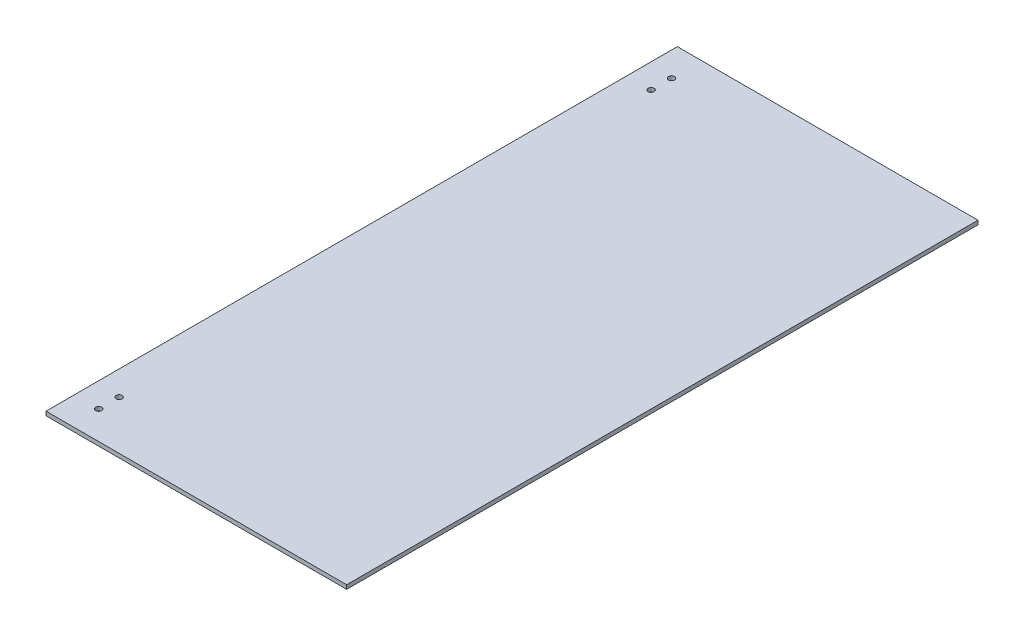
ISO-10303-21;
HEADER;
FILE_DESCRIPTION(('STEP AP214'),'2;1');
FILE_NAME('part.step','',(''),(''),'','','');
FILE_SCHEMA(('AUTOMOTIVE_DESIGN { 1 0 10303 214 1 1 1 1 }'));
ENDSEC;
DATA;
#1=APPLICATION_CONTEXT('core data for automotive mechanical design processes');
#2=APPLICATION_PROTOCOL_DEFINITION('international standard','automotive_design',2000,#1);
#3=PRODUCT_CONTEXT('',#1,'mechanical');
#4=PRODUCT('Part','Part','',(#3));
#5=PRODUCT_RELATED_PRODUCT_CATEGORY('part','',(#4));
#6=PRODUCT_DEFINITION_FORMATION('','',#4);
#7=PRODUCT_DEFINITION_CONTEXT('part definition',#1,'design');
#8=PRODUCT_DEFINITION('design','',#6,#7);
#9=PRODUCT_DEFINITION_SHAPE('','',#8);
#10=(LENGTH_UNIT() NAMED_UNIT(*) SI_UNIT(.MILLI.,.METRE.));
#11=(NAMED_UNIT(*) PLANE_ANGLE_UNIT() SI_UNIT($,.RADIAN.));
#12=(NAMED_UNIT(*) SI_UNIT($,.STERADIAN.) SOLID_ANGLE_UNIT());
#13=UNCERTAINTY_MEASURE_WITH_UNIT(LENGTH_MEASURE(1.E-05),#10,'distance_accuracy_value','');
#14=(GEOMETRIC_REPRESENTATION_CONTEXT(3) GLOBAL_UNCERTAINTY_ASSIGNED_CONTEXT((#13)) GLOBAL_UNIT_ASSIGNED_CONTEXT((#10,
#11,#12)) REPRESENTATION_CONTEXT('',''));
#15=CARTESIAN_POINT('',(0.,0.,0.));
#16=DIRECTION('',(0.,0.,1.));
#17=DIRECTION('',(1.,0.,0.));
#18=AXIS2_PLACEMENT_3D('',#15,#16,#17);
#19=CARTESIAN_POINT('',(75.,2.,-157.5));
#20=DIRECTION('',(-1.,0.,0.));
#21=DIRECTION('',(0.,0.,1.));
#22=AXIS2_PLACEMENT_3D('',#19,#20,#21);
#23=PLANE('',#22);
#24=DIRECTION('',(0.,0.,-1.));
#25=VECTOR('',#24,1.);
#26=CARTESIAN_POINT('',(75.,0.,-157.5));
#27=LINE('',#26,#25);
#28=CARTESIAN_POINT('',(75.,0.,157.5));
#29=VERTEX_POINT('',#28);
#30=CARTESIAN_POINT('',(75.,0.,-157.5));
#31=VERTEX_POINT('',#30);
#32=EDGE_CURVE('E98',#29,#31,#27,.T.);
#33=ORIENTED_EDGE('',*,*,#32,.T.);
#34=DIRECTION('',(0.,-1.,0.));
#35=VECTOR('',#34,1.);
#36=CARTESIAN_POINT('',(75.,2.,-157.5));
#37=LINE('',#36,#35);
#38=CARTESIAN_POINT('',(75.,2.,-157.5));
#39=VERTEX_POINT('',#38);
#40=EDGE_CURVE('E11',#39,#31,#37,.T.);
#41=ORIENTED_EDGE('',*,*,#40,.F.);
#42=DIRECTION('',(0.,0.,-1.));
#43=VECTOR('',#42,1.);
#44=CARTESIAN_POINT('',(75.,2.,-157.5));
#45=LINE('',#44,#43);
#46=CARTESIAN_POINT('',(75.,2.,157.5));
#47=VERTEX_POINT('',#46);
#48=EDGE_CURVE('E86',#47,#39,#45,.T.);
#49=ORIENTED_EDGE('',*,*,#48,.F.);
#50=DIRECTION('',(0.,-1.,0.));
#51=VECTOR('',#50,1.);
#52=CARTESIAN_POINT('',(75.,2.,157.5));
#53=LINE('',#52,#51);
#54=EDGE_CURVE('E94',#47,#29,#53,.T.);
#55=ORIENTED_EDGE('',*,*,#54,.T.);
#56=EDGE_LOOP('',(#33,#41,#49,#55));
#57=FACE_BOUND('',#56,.T.);
#58=ADVANCED_FACE('F35',(#57),#23,.F.);
#59=CARTESIAN_POINT('',(-75.,2.,-157.5));
#60=DIRECTION('',(0.,0.,1.));
#61=DIRECTION('',(1.,0.,0.));
#62=AXIS2_PLACEMENT_3D('',#59,#60,#61);
#63=PLANE('',#62);
#64=DIRECTION('',(-1.,0.,0.));
#65=VECTOR('',#64,1.);
#66=CARTESIAN_POINT('',(-75.,0.,-157.5));
#67=LINE('',#66,#65);
#68=CARTESIAN_POINT('',(-75.,0.,-157.5));
#69=VERTEX_POINT('',#68);
#70=EDGE_CURVE('E90',#31,#69,#67,.T.);
#71=ORIENTED_EDGE('',*,*,#70,.T.);
#72=DIRECTION('',(0.,-1.,0.));
#73=VECTOR('',#72,1.);
#74=CARTESIAN_POINT('',(-75.,2.,-157.5));
#75=LINE('',#74,#73);
#76=CARTESIAN_POINT('',(-75.,2.,-157.5));
#77=VERTEX_POINT('',#76);
#78=EDGE_CURVE('E43',#77,#69,#75,.T.);
#79=ORIENTED_EDGE('',*,*,#78,.F.);
#80=DIRECTION('',(-1.,0.,0.));
#81=VECTOR('',#80,1.);
#82=CARTESIAN_POINT('',(-75.,2.,-157.5));
#83=LINE('',#82,#81);
#84=EDGE_CURVE('E81',#39,#77,#83,.T.);
#85=ORIENTED_EDGE('',*,*,#84,.F.);
#86=ORIENTED_EDGE('',*,*,#40,.T.);
#87=EDGE_LOOP('',(#71,#79,#85,#86));
#88=FACE_BOUND('',#87,.T.);
#89=ADVANCED_FACE('F89',(#88),#63,.F.);
#90=CARTESIAN_POINT('',(-75.,2.,-157.5));
#91=DIRECTION('',(1.,0.,0.));
#92=DIRECTION('',(0.,0.,-1.));
#93=AXIS2_PLACEMENT_3D('',#90,#91,#92);
#94=PLANE('',#93);
#95=DIRECTION('',(0.,0.,1.));
#96=VECTOR('',#95,1.);
#97=CARTESIAN_POINT('',(-75.,0.,-157.5));
#98=LINE('',#97,#96);
#99=CARTESIAN_POINT('',(-75.,0.,157.5));
#100=VERTEX_POINT('',#99);
#101=EDGE_CURVE('E68',#69,#100,#98,.T.);
#102=ORIENTED_EDGE('',*,*,#101,.T.);
#103=DIRECTION('',(0.,-1.,0.));
#104=VECTOR('',#103,1.);
#105=CARTESIAN_POINT('',(-75.,2.,157.5));
#106=LINE('',#105,#104);
#107=CARTESIAN_POINT('',(-75.,2.,157.5));
#108=VERTEX_POINT('',#107);
#109=EDGE_CURVE('E91',#108,#100,#106,.T.);
#110=ORIENTED_EDGE('',*,*,#109,.F.);
#111=DIRECTION('',(0.,0.,1.));
#112=VECTOR('',#111,1.);
#113=CARTESIAN_POINT('',(-75.,2.,-157.5));
#114=LINE('',#113,#112);
#115=EDGE_CURVE('E84',#77,#108,#114,.T.);
#116=ORIENTED_EDGE('',*,*,#115,.F.);
#117=ORIENTED_EDGE('',*,*,#78,.T.);
#118=EDGE_LOOP('',(#102,#110,#116,#117));
#119=FACE_BOUND('',#118,.T.);
#120=ADVANCED_FACE('F92',(#119),#94,.F.);
#121=CARTESIAN_POINT('',(-75.,2.,157.5));
#122=DIRECTION('',(0.,0.,-1.));
#123=DIRECTION('',(-1.,0.,0.));
#124=AXIS2_PLACEMENT_3D('',#121,#122,#123);
#125=PLANE('',#124);
#126=DIRECTION('',(1.,0.,0.));
#127=VECTOR('',#126,1.);
#128=CARTESIAN_POINT('',(-75.,0.,157.5));
#129=LINE('',#128,#127);
#130=EDGE_CURVE('E74',#100,#29,#129,.T.);
#131=ORIENTED_EDGE('',*,*,#130,.T.);
#132=ORIENTED_EDGE('',*,*,#54,.F.);
#133=DIRECTION('',(1.,0.,0.));
#134=VECTOR('',#133,1.);
#135=CARTESIAN_POINT('',(-75.,2.,157.5));
#136=LINE('',#135,#134);
#137=EDGE_CURVE('E51',#108,#47,#136,.T.);
#138=ORIENTED_EDGE('',*,*,#137,.F.);
#139=ORIENTED_EDGE('',*,*,#109,.T.);
#140=EDGE_LOOP('',(#131,#132,#138,#139));
#141=FACE_BOUND('',#140,.T.);
#142=ADVANCED_FACE('F106',(#141),#125,.F.);
#143=CARTESIAN_POINT('',(0.,2.,0.));
#144=DIRECTION('',(0.,1.,0.));
#145=DIRECTION('',(0.,0.,1.));
#146=AXIS2_PLACEMENT_3D('',#143,#144,#145);
#147=PLANE('',#146);
#148=CARTESIAN_POINT('',(-62.8272865939275,2.,-142.405071148297));
#149=DIRECTION('',(0.,1.,0.));
#150=DIRECTION('',(0.,0.,1.));
#151=AXIS2_PLACEMENT_3D('',#148,#149,#150);
#152=CIRCLE('',#151,1.5);
#153=CARTESIAN_POINT('',(-62.8272865939275,2.,-140.905071148297));
#154=VERTEX_POINT('',#153);
#155=EDGE_CURVE('E130',#154,#154,#152,.T.);
#156=ORIENTED_EDGE('',*,*,#155,.F.);
#157=EDGE_LOOP('',(#156));
#158=FACE_BOUND('',#157,.T.);
#159=CARTESIAN_POINT('',(-62.8272865939275,2.,-132.232566199556));
#160=DIRECTION('',(0.,1.,0.));
#161=DIRECTION('',(0.,0.,1.));
#162=AXIS2_PLACEMENT_3D('',#159,#160,#161);
#163=CIRCLE('',#162,1.50000000000001);
#164=CARTESIAN_POINT('',(-62.8272865939275,2.,-130.732566199556));
#165=VERTEX_POINT('',#164);
#166=EDGE_CURVE('E124',#165,#165,#163,.T.);
#167=ORIENTED_EDGE('',*,*,#166,.F.);
#168=EDGE_LOOP('',(#167));
#169=FACE_BOUND('',#168,.T.);
#170=CARTESIAN_POINT('',(-62.8272865939274,2.,133.206048981527));
#171=DIRECTION('',(0.,1.,0.));
#172=DIRECTION('',(0.,0.,1.));
#173=AXIS2_PLACEMENT_3D('',#170,#171,#172);
#174=CIRCLE('',#173,1.50000000000001);
#175=CARTESIAN_POINT('',(-62.8272865939274,2.,134.706048981527));
#176=VERTEX_POINT('',#175);
#177=EDGE_CURVE('E118',#176,#176,#174,.T.);
#178=ORIENTED_EDGE('',*,*,#177,.F.);
#179=EDGE_LOOP('',(#178));
#180=FACE_BOUND('',#179,.T.);
#181=CARTESIAN_POINT('',(-62.8272865939274,2.,143.378553930269));
#182=DIRECTION('',(0.,1.,0.));
#183=DIRECTION('',(0.,0.,1.));
#184=AXIS2_PLACEMENT_3D('',#181,#182,#183);
#185=CIRCLE('',#184,1.49999999999999);
#186=CARTESIAN_POINT('',(-62.8272865939274,2.,144.878553930269));
#187=VERTEX_POINT('',#186);
#188=EDGE_CURVE('E112',#187,#187,#185,.T.);
#189=ORIENTED_EDGE('',*,*,#188,.F.);
#190=EDGE_LOOP('',(#189));
#191=FACE_BOUND('',#190,.T.);
#192=ORIENTED_EDGE('',*,*,#48,.T.);
#193=ORIENTED_EDGE('',*,*,#84,.T.);
#194=ORIENTED_EDGE('',*,*,#115,.T.);
#195=ORIENTED_EDGE('',*,*,#137,.T.);
#196=EDGE_LOOP('',(#192,#193,#194,#195));
#197=FACE_BOUND('',#196,.T.);
#198=ADVANCED_FACE('F82',(#158,#169,#180,#191,#197),#147,.T.);
#199=CARTESIAN_POINT('',(0.,0.,0.));
#200=DIRECTION('',(0.,1.,0.));
#201=DIRECTION('',(0.,0.,1.));
#202=AXIS2_PLACEMENT_3D('',#199,#200,#201);
#203=PLANE('',#202);
#204=CARTESIAN_POINT('',(-62.8272865939275,0.,-142.405071148297));
#205=DIRECTION('',(0.,1.,0.));
#206=DIRECTION('',(0.,0.,1.));
#207=AXIS2_PLACEMENT_3D('',#204,#205,#206);
#208=CIRCLE('',#207,1.5);
#209=CARTESIAN_POINT('',(-62.8272865939275,0.,-140.905071148297));
#210=VERTEX_POINT('',#209);
#211=EDGE_CURVE('E127',#210,#210,#208,.T.);
#212=ORIENTED_EDGE('',*,*,#211,.T.);
#213=EDGE_LOOP('',(#212));
#214=FACE_BOUND('',#213,.T.);
#215=CARTESIAN_POINT('',(-62.8272865939275,0.,-132.232566199556));
#216=DIRECTION('',(0.,1.,0.));
#217=DIRECTION('',(0.,0.,1.));
#218=AXIS2_PLACEMENT_3D('',#215,#216,#217);
#219=CIRCLE('',#218,1.50000000000001);
#220=CARTESIAN_POINT('',(-62.8272865939275,0.,-130.732566199556));
#221=VERTEX_POINT('',#220);
#222=EDGE_CURVE('E121',#221,#221,#219,.T.);
#223=ORIENTED_EDGE('',*,*,#222,.T.);
#224=EDGE_LOOP('',(#223));
#225=FACE_BOUND('',#224,.T.);
#226=CARTESIAN_POINT('',(-62.8272865939274,0.,133.206048981527));
#227=DIRECTION('',(0.,1.,0.));
#228=DIRECTION('',(0.,0.,1.));
#229=AXIS2_PLACEMENT_3D('',#226,#227,#228);
#230=CIRCLE('',#229,1.50000000000001);
#231=CARTESIAN_POINT('',(-62.8272865939274,0.,134.706048981527));
#232=VERTEX_POINT('',#231);
#233=EDGE_CURVE('E115',#232,#232,#230,.T.);
#234=ORIENTED_EDGE('',*,*,#233,.T.);
#235=EDGE_LOOP('',(#234));
#236=FACE_BOUND('',#235,.T.);
#237=CARTESIAN_POINT('',(-62.8272865939274,0.,143.378553930269));
#238=DIRECTION('',(0.,1.,0.));
#239=DIRECTION('',(0.,0.,1.));
#240=AXIS2_PLACEMENT_3D('',#237,#238,#239);
#241=CIRCLE('',#240,1.49999999999999);
#242=CARTESIAN_POINT('',(-62.8272865939274,0.,144.878553930269));
#243=VERTEX_POINT('',#242);
#244=EDGE_CURVE('E101',#243,#243,#241,.T.);
#245=ORIENTED_EDGE('',*,*,#244,.T.);
#246=EDGE_LOOP('',(#245));
#247=FACE_BOUND('',#246,.T.);
#248=ORIENTED_EDGE('',*,*,#32,.F.);
#249=ORIENTED_EDGE('',*,*,#130,.F.);
#250=ORIENTED_EDGE('',*,*,#101,.F.);
#251=ORIENTED_EDGE('',*,*,#70,.F.);
#252=EDGE_LOOP('',(#248,#249,#250,#251));
#253=FACE_BOUND('',#252,.T.);
#254=ADVANCED_FACE('F109',(#214,#225,#236,#247,#253),#203,.F.);
#255=CARTESIAN_POINT('',(-62.8272865939274,0.,143.378553930269));
#256=DIRECTION('',(0.,1.,0.));
#257=DIRECTION('',(0.,0.,1.));
#258=AXIS2_PLACEMENT_3D('',#255,#256,#257);
#259=CYLINDRICAL_SURFACE('',#258,1.49999999999999);
#260=ORIENTED_EDGE('',*,*,#244,.F.);
#261=EDGE_LOOP('',(#260));
#262=FACE_BOUND('',#261,.T.);
#263=ORIENTED_EDGE('',*,*,#188,.T.);
#264=EDGE_LOOP('',(#263));
#265=FACE_BOUND('',#264,.T.);
#266=ADVANCED_FACE('F154',(#262,#265),#259,.F.);
#267=CARTESIAN_POINT('',(-62.8272865939274,0.,133.206048981527));
#268=DIRECTION('',(0.,1.,0.));
#269=DIRECTION('',(0.,0.,1.));
#270=AXIS2_PLACEMENT_3D('',#267,#268,#269);
#271=CYLINDRICAL_SURFACE('',#270,1.50000000000001);
#272=ORIENTED_EDGE('',*,*,#233,.F.);
#273=EDGE_LOOP('',(#272));
#274=FACE_BOUND('',#273,.T.);
#275=ORIENTED_EDGE('',*,*,#177,.T.);
#276=EDGE_LOOP('',(#275));
#277=FACE_BOUND('',#276,.T.);
#278=ADVANCED_FACE('F156',(#274,#277),#271,.F.);
#279=CARTESIAN_POINT('',(-62.8272865939275,0.,-132.232566199556));
#280=DIRECTION('',(0.,1.,0.));
#281=DIRECTION('',(0.,0.,1.));
#282=AXIS2_PLACEMENT_3D('',#279,#280,#281);
#283=CYLINDRICAL_SURFACE('',#282,1.50000000000001);
#284=ORIENTED_EDGE('',*,*,#222,.F.);
#285=EDGE_LOOP('',(#284));
#286=FACE_BOUND('',#285,.T.);
#287=ORIENTED_EDGE('',*,*,#166,.T.);
#288=EDGE_LOOP('',(#287));
#289=FACE_BOUND('',#288,.T.);
#290=ADVANCED_FACE('F141',(#286,#289),#283,.F.);
#291=CARTESIAN_POINT('',(-62.8272865939275,0.,-142.405071148297));
#292=DIRECTION('',(0.,1.,0.));
#293=DIRECTION('',(0.,0.,1.));
#294=AXIS2_PLACEMENT_3D('',#291,#292,#293);
#295=CYLINDRICAL_SURFACE('',#294,1.5);
#296=ORIENTED_EDGE('',*,*,#211,.F.);
#297=EDGE_LOOP('',(#296));
#298=FACE_BOUND('',#297,.T.);
#299=ORIENTED_EDGE('',*,*,#155,.T.);
#300=EDGE_LOOP('',(#299));
#301=FACE_BOUND('',#300,.T.);
#302=ADVANCED_FACE('F138',(#298,#301),#295,.F.);
#303=CLOSED_SHELL('',(#58,#89,#120,#142,#198,#254,#266,#278,#290,#302));
#304=MANIFOLD_SOLID_BREP('B2',#303);
#305=ADVANCED_BREP_SHAPE_REPRESENTATION('',(#18,#304),#14);
#306=SHAPE_DEFINITION_REPRESENTATION(#9,#305);
ENDSEC;
END-ISO-10303-21;
